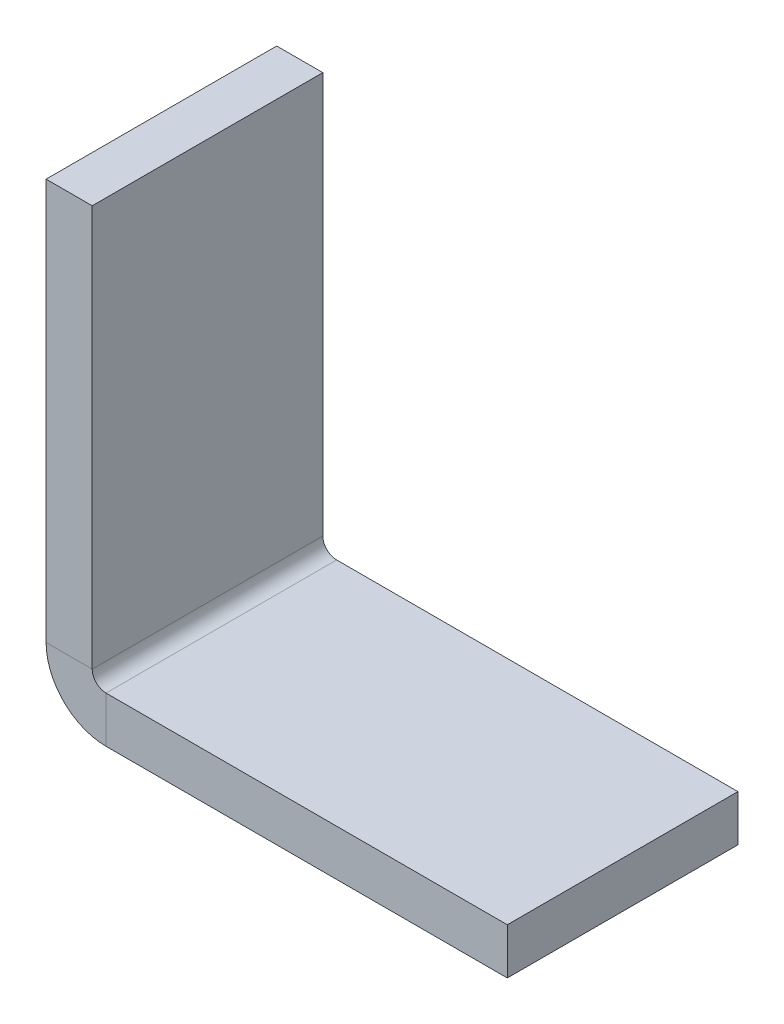
ISO-10303-21;
HEADER;
FILE_DESCRIPTION(('STEP AP214'),'2;1');
FILE_NAME('part.step','',(''),(''),'','','');
FILE_SCHEMA(('AUTOMOTIVE_DESIGN { 1 0 10303 214 1 1 1 1 }'));
ENDSEC;
DATA;
#1=APPLICATION_CONTEXT('core data for automotive mechanical design processes');
#2=APPLICATION_PROTOCOL_DEFINITION('international standard','automotive_design',2000,#1);
#3=PRODUCT_CONTEXT('',#1,'mechanical');
#4=PRODUCT('Part','Part','',(#3));
#5=PRODUCT_RELATED_PRODUCT_CATEGORY('part','',(#4));
#6=PRODUCT_DEFINITION_FORMATION('','',#4);
#7=PRODUCT_DEFINITION_CONTEXT('part definition',#1,'design');
#8=PRODUCT_DEFINITION('design','',#6,#7);
#9=PRODUCT_DEFINITION_SHAPE('','',#8);
#10=(LENGTH_UNIT() NAMED_UNIT(*) SI_UNIT(.MILLI.,.METRE.));
#11=(NAMED_UNIT(*) PLANE_ANGLE_UNIT() SI_UNIT($,.RADIAN.));
#12=(NAMED_UNIT(*) SI_UNIT($,.STERADIAN.) SOLID_ANGLE_UNIT());
#13=UNCERTAINTY_MEASURE_WITH_UNIT(LENGTH_MEASURE(1.E-05),#10,'distance_accuracy_value','');
#14=(GEOMETRIC_REPRESENTATION_CONTEXT(3) GLOBAL_UNCERTAINTY_ASSIGNED_CONTEXT((#13)) GLOBAL_UNIT_ASSIGNED_CONTEXT((#10,
#11,#12)) REPRESENTATION_CONTEXT('',''));
#15=CARTESIAN_POINT('',(0.,0.,0.));
#16=DIRECTION('',(0.,0.,1.));
#17=DIRECTION('',(1.,0.,0.));
#18=AXIS2_PLACEMENT_3D('',#15,#16,#17);
#19=CARTESIAN_POINT('',(53.5149587150397,25.4,0.));
#20=DIRECTION('',(0.,0.,1.));
#21=DIRECTION('',(0.,-1.,0.));
#22=AXIS2_PLACEMENT_3D('',#19,#20,#21);
#23=PLANE('',#22);
#24=DIRECTION('',(-1.,0.,0.));
#25=VECTOR('',#24,1.);
#26=CARTESIAN_POINT('',(53.5149587150397,3.302,0.));
#27=LINE('',#26,#25);
#28=CARTESIAN_POINT('',(2.54,3.302,0.));
#29=VERTEX_POINT('',#28);
#30=CARTESIAN_POINT('',(0.,3.302,0.));
#31=VERTEX_POINT('',#30);
#32=EDGE_CURVE('E50',#29,#31,#27,.T.);
#33=ORIENTED_EDGE('',*,*,#32,.T.);
#34=DIRECTION('',(0.,-1.,0.));
#35=VECTOR('',#34,1.);
#36=CARTESIAN_POINT('',(0.,25.4,0.));
#37=LINE('',#36,#35);
#38=CARTESIAN_POINT('',(0.,25.4,0.));
#39=VERTEX_POINT('',#38);
#40=EDGE_CURVE('E57',#39,#31,#37,.T.);
#41=ORIENTED_EDGE('',*,*,#40,.F.);
#42=DIRECTION('',(-1.,0.,0.));
#43=VECTOR('',#42,1.);
#44=CARTESIAN_POINT('',(53.5149587150397,25.4,0.));
#45=LINE('',#44,#43);
#46=CARTESIAN_POINT('',(2.54000000000001,25.4,0.));
#47=VERTEX_POINT('',#46);
#48=EDGE_CURVE('E185',#47,#39,#45,.T.);
#49=ORIENTED_EDGE('',*,*,#48,.F.);
#50=DIRECTION('',(0.,1.,0.));
#51=VECTOR('',#50,1.);
#52=CARTESIAN_POINT('',(2.54,25.4,0.));
#53=LINE('',#52,#51);
#54=EDGE_CURVE('E173',#29,#47,#53,.T.);
#55=ORIENTED_EDGE('',*,*,#54,.F.);
#56=EDGE_LOOP('',(#33,#41,#49,#55));
#57=FACE_BOUND('',#56,.T.);
#58=ADVANCED_FACE('F43',(#57),#23,.F.);
#59=CARTESIAN_POINT('',(53.5149587150397,25.4,12.7));
#60=DIRECTION('',(0.,1.,0.));
#61=DIRECTION('',(-1.,0.,0.));
#62=AXIS2_PLACEMENT_3D('',#59,#60,#61);
#63=PLANE('',#62);
#64=DIRECTION('',(0.,0.,-1.));
#65=VECTOR('',#64,1.);
#66=CARTESIAN_POINT('',(0.,25.4,12.7));
#67=LINE('',#66,#65);
#68=CARTESIAN_POINT('',(0.,25.4,12.7));
#69=VERTEX_POINT('',#68);
#70=EDGE_CURVE('E169',#69,#39,#67,.T.);
#71=ORIENTED_EDGE('',*,*,#70,.F.);
#72=DIRECTION('',(-1.,0.,0.));
#73=VECTOR('',#72,1.);
#74=CARTESIAN_POINT('',(53.5149587150397,25.4,12.7));
#75=LINE('',#74,#73);
#76=CARTESIAN_POINT('',(2.54000000000001,25.4,12.7));
#77=VERTEX_POINT('',#76);
#78=EDGE_CURVE('E183',#77,#69,#75,.T.);
#79=ORIENTED_EDGE('',*,*,#78,.F.);
#80=DIRECTION('',(0.,0.,-1.));
#81=VECTOR('',#80,1.);
#82=CARTESIAN_POINT('',(2.54,25.4,12.7));
#83=LINE('',#82,#81);
#84=EDGE_CURVE('E64',#77,#47,#83,.T.);
#85=ORIENTED_EDGE('',*,*,#84,.T.);
#86=ORIENTED_EDGE('',*,*,#48,.T.);
#87=EDGE_LOOP('',(#71,#79,#85,#86));
#88=FACE_BOUND('',#87,.T.);
#89=ADVANCED_FACE('F191',(#88),#63,.T.);
#90=CARTESIAN_POINT('',(53.5149587150397,25.4,12.7));
#91=DIRECTION('',(0.,0.,1.));
#92=DIRECTION('',(0.,-1.,0.));
#93=AXIS2_PLACEMENT_3D('',#90,#91,#92);
#94=PLANE('',#93);
#95=DIRECTION('',(0.,-1.,0.));
#96=VECTOR('',#95,1.);
#97=CARTESIAN_POINT('',(0.,25.4,12.7));
#98=LINE('',#97,#96);
#99=CARTESIAN_POINT('',(0.,3.302,12.7));
#100=VERTEX_POINT('',#99);
#101=EDGE_CURVE('E166',#69,#100,#98,.T.);
#102=ORIENTED_EDGE('',*,*,#101,.T.);
#103=DIRECTION('',(-1.,0.,0.));
#104=VECTOR('',#103,1.);
#105=CARTESIAN_POINT('',(53.5149587150397,3.302,12.7));
#106=LINE('',#105,#104);
#107=CARTESIAN_POINT('',(2.54,3.302,12.7));
#108=VERTEX_POINT('',#107);
#109=EDGE_CURVE('E180',#108,#100,#106,.T.);
#110=ORIENTED_EDGE('',*,*,#109,.F.);
#111=DIRECTION('',(0.,-1.,0.));
#112=VECTOR('',#111,1.);
#113=CARTESIAN_POINT('',(2.54,25.4,12.7));
#114=LINE('',#113,#112);
#115=EDGE_CURVE('E11',#77,#108,#114,.T.);
#116=ORIENTED_EDGE('',*,*,#115,.F.);
#117=ORIENTED_EDGE('',*,*,#78,.T.);
#118=EDGE_LOOP('',(#102,#110,#116,#117));
#119=FACE_BOUND('',#118,.T.);
#120=ADVANCED_FACE('F203',(#119),#94,.T.);
#121=CARTESIAN_POINT('',(2.54,25.4,12.7));
#122=DIRECTION('',(-1.,0.,0.));
#123=DIRECTION('',(0.,0.,1.));
#124=AXIS2_PLACEMENT_3D('',#121,#122,#123);
#125=PLANE('',#124);
#126=ORIENTED_EDGE('',*,*,#115,.T.);
#127=DIRECTION('',(0.,0.,-1.));
#128=VECTOR('',#127,1.);
#129=CARTESIAN_POINT('',(2.54,3.302,0.));
#130=LINE('',#129,#128);
#131=EDGE_CURVE('E177',#108,#29,#130,.T.);
#132=ORIENTED_EDGE('',*,*,#131,.T.);
#133=ORIENTED_EDGE('',*,*,#54,.T.);
#134=ORIENTED_EDGE('',*,*,#84,.F.);
#135=EDGE_LOOP('',(#126,#132,#133,#134));
#136=FACE_BOUND('',#135,.T.);
#137=ADVANCED_FACE('F193',(#136),#125,.F.);
#138=CARTESIAN_POINT('',(0.,25.4,12.7));
#139=DIRECTION('',(1.,0.,0.));
#140=DIRECTION('',(0.,0.,-1.));
#141=AXIS2_PLACEMENT_3D('',#138,#139,#140);
#142=PLANE('',#141);
#143=ORIENTED_EDGE('',*,*,#40,.T.);
#144=DIRECTION('',(0.,0.,1.));
#145=VECTOR('',#144,1.);
#146=CARTESIAN_POINT('',(0.,3.302,0.));
#147=LINE('',#146,#145);
#148=EDGE_CURVE('E128',#31,#100,#147,.T.);
#149=ORIENTED_EDGE('',*,*,#148,.T.);
#150=ORIENTED_EDGE('',*,*,#101,.F.);
#151=ORIENTED_EDGE('',*,*,#70,.T.);
#152=EDGE_LOOP('',(#143,#149,#150,#151));
#153=FACE_BOUND('',#152,.T.);
#154=ADVANCED_FACE('F188',(#153),#142,.F.);
#155=CARTESIAN_POINT('',(25.4,53.5149587150397,12.7));
#156=DIRECTION('',(-1.,0.,0.));
#157=DIRECTION('',(0.,0.,1.));
#158=AXIS2_PLACEMENT_3D('',#155,#156,#157);
#159=PLANE('',#158);
#160=DIRECTION('',(0.,-1.,0.));
#161=VECTOR('',#160,1.);
#162=CARTESIAN_POINT('',(25.4,53.5149587150397,12.7));
#163=LINE('',#162,#161);
#164=CARTESIAN_POINT('',(25.4,2.54000000000001,12.7));
#165=VERTEX_POINT('',#164);
#166=CARTESIAN_POINT('',(25.4,0.,12.7));
#167=VERTEX_POINT('',#166);
#168=EDGE_CURVE('E140',#165,#167,#163,.T.);
#169=ORIENTED_EDGE('',*,*,#168,.T.);
#170=DIRECTION('',(0.,0.,-1.));
#171=VECTOR('',#170,1.);
#172=CARTESIAN_POINT('',(25.4,0.,12.7));
#173=LINE('',#172,#171);
#174=CARTESIAN_POINT('',(25.4,0.,0.));
#175=VERTEX_POINT('',#174);
#176=EDGE_CURVE('E160',#167,#175,#173,.T.);
#177=ORIENTED_EDGE('',*,*,#176,.T.);
#178=DIRECTION('',(0.,-1.,0.));
#179=VECTOR('',#178,1.);
#180=CARTESIAN_POINT('',(25.4,53.5149587150397,0.));
#181=LINE('',#180,#179);
#182=CARTESIAN_POINT('',(25.4,2.54,0.));
#183=VERTEX_POINT('',#182);
#184=EDGE_CURVE('E145',#183,#175,#181,.T.);
#185=ORIENTED_EDGE('',*,*,#184,.F.);
#186=DIRECTION('',(0.,0.,-1.));
#187=VECTOR('',#186,1.);
#188=CARTESIAN_POINT('',(25.4,2.54,12.7));
#189=LINE('',#188,#187);
#190=EDGE_CURVE('E158',#165,#183,#189,.T.);
#191=ORIENTED_EDGE('',*,*,#190,.F.);
#192=EDGE_LOOP('',(#169,#177,#185,#191));
#193=FACE_BOUND('',#192,.T.);
#194=ADVANCED_FACE('F230',(#193),#159,.F.);
#195=CARTESIAN_POINT('',(2.54,2.54,12.7));
#196=DIRECTION('',(0.,-1.,0.));
#197=DIRECTION('',(0.,0.,-1.));
#198=AXIS2_PLACEMENT_3D('',#195,#196,#197);
#199=PLANE('',#198);
#200=DIRECTION('',(0.,0.,-1.));
#201=VECTOR('',#200,1.);
#202=CARTESIAN_POINT('',(3.302,2.54,0.));
#203=LINE('',#202,#201);
#204=CARTESIAN_POINT('',(3.302,2.54,12.7));
#205=VERTEX_POINT('',#204);
#206=CARTESIAN_POINT('',(3.302,2.54,0.));
#207=VERTEX_POINT('',#206);
#208=EDGE_CURVE('E121',#205,#207,#203,.T.);
#209=ORIENTED_EDGE('',*,*,#208,.F.);
#210=DIRECTION('',(-1.,0.,0.));
#211=VECTOR('',#210,1.);
#212=CARTESIAN_POINT('',(2.54,2.54,12.7));
#213=LINE('',#212,#211);
#214=EDGE_CURVE('E149',#165,#205,#213,.T.);
#215=ORIENTED_EDGE('',*,*,#214,.F.);
#216=ORIENTED_EDGE('',*,*,#190,.T.);
#217=DIRECTION('',(-1.,0.,0.));
#218=VECTOR('',#217,1.);
#219=CARTESIAN_POINT('',(2.54,2.54,0.));
#220=LINE('',#219,#218);
#221=EDGE_CURVE('E156',#183,#207,#220,.T.);
#222=ORIENTED_EDGE('',*,*,#221,.T.);
#223=EDGE_LOOP('',(#209,#215,#216,#222));
#224=FACE_BOUND('',#223,.T.);
#225=ADVANCED_FACE('F235',(#224),#199,.F.);
#226=CARTESIAN_POINT('',(2.54,53.5149587150397,12.7));
#227=DIRECTION('',(0.,0.,1.));
#228=DIRECTION('',(1.,0.,0.));
#229=AXIS2_PLACEMENT_3D('',#226,#227,#228);
#230=PLANE('',#229);
#231=DIRECTION('',(1.,0.,0.));
#232=VECTOR('',#231,1.);
#233=CARTESIAN_POINT('',(0.,0.,12.7));
#234=LINE('',#233,#232);
#235=CARTESIAN_POINT('',(3.302,0.,12.7));
#236=VERTEX_POINT('',#235);
#237=EDGE_CURVE('E138',#236,#167,#234,.T.);
#238=ORIENTED_EDGE('',*,*,#237,.T.);
#239=ORIENTED_EDGE('',*,*,#168,.F.);
#240=ORIENTED_EDGE('',*,*,#214,.T.);
#241=DIRECTION('',(0.,-1.,0.));
#242=VECTOR('',#241,1.);
#243=CARTESIAN_POINT('',(3.302,53.5149587150397,12.7));
#244=LINE('',#243,#242);
#245=EDGE_CURVE('E146',#205,#236,#244,.T.);
#246=ORIENTED_EDGE('',*,*,#245,.T.);
#247=EDGE_LOOP('',(#238,#239,#240,#246));
#248=FACE_BOUND('',#247,.T.);
#249=ADVANCED_FACE('F245',(#248),#230,.T.);
#250=CARTESIAN_POINT('',(0.,0.,12.7));
#251=DIRECTION('',(0.,1.,0.));
#252=DIRECTION('',(0.,0.,1.));
#253=AXIS2_PLACEMENT_3D('',#250,#251,#252);
#254=PLANE('',#253);
#255=DIRECTION('',(0.,0.,1.));
#256=VECTOR('',#255,1.);
#257=CARTESIAN_POINT('',(3.302,0.,0.));
#258=LINE('',#257,#256);
#259=CARTESIAN_POINT('',(3.302,0.,0.));
#260=VERTEX_POINT('',#259);
#261=EDGE_CURVE('E120',#260,#236,#258,.T.);
#262=ORIENTED_EDGE('',*,*,#261,.F.);
#263=DIRECTION('',(1.,0.,0.));
#264=VECTOR('',#263,1.);
#265=CARTESIAN_POINT('',(0.,0.,0.));
#266=LINE('',#265,#264);
#267=EDGE_CURVE('E135',#260,#175,#266,.T.);
#268=ORIENTED_EDGE('',*,*,#267,.T.);
#269=ORIENTED_EDGE('',*,*,#176,.F.);
#270=ORIENTED_EDGE('',*,*,#237,.F.);
#271=EDGE_LOOP('',(#262,#268,#269,#270));
#272=FACE_BOUND('',#271,.T.);
#273=ADVANCED_FACE('F134',(#272),#254,.F.);
#274=CARTESIAN_POINT('',(2.54,53.5149587150397,0.));
#275=DIRECTION('',(0.,0.,1.));
#276=DIRECTION('',(1.,0.,0.));
#277=AXIS2_PLACEMENT_3D('',#274,#275,#276);
#278=PLANE('',#277);
#279=ORIENTED_EDGE('',*,*,#184,.T.);
#280=ORIENTED_EDGE('',*,*,#267,.F.);
#281=DIRECTION('',(0.,-1.,0.));
#282=VECTOR('',#281,1.);
#283=CARTESIAN_POINT('',(3.302,53.5149587150397,0.));
#284=LINE('',#283,#282);
#285=EDGE_CURVE('E109',#207,#260,#284,.T.);
#286=ORIENTED_EDGE('',*,*,#285,.F.);
#287=ORIENTED_EDGE('',*,*,#221,.F.);
#288=EDGE_LOOP('',(#279,#280,#286,#287));
#289=FACE_BOUND('',#288,.T.);
#290=ADVANCED_FACE('F143',(#289),#278,.F.);
#291=CARTESIAN_POINT('',(3.302,3.302,0.));
#292=DIRECTION('',(0.,0.,-1.));
#293=DIRECTION('',(-1.,0.,0.));
#294=AXIS2_PLACEMENT_3D('',#291,#292,#293);
#295=PLANE('',#294);
#296=ORIENTED_EDGE('',*,*,#32,.F.);
#297=CARTESIAN_POINT('',(3.302,3.302,0.));
#298=DIRECTION('',(0.,0.,1.));
#299=DIRECTION('',(1.,0.,0.));
#300=AXIS2_PLACEMENT_3D('',#297,#298,#299);
#301=CIRCLE('',#300,0.762);
#302=EDGE_CURVE('E114',#29,#207,#301,.T.);
#303=ORIENTED_EDGE('',*,*,#302,.T.);
#304=ORIENTED_EDGE('',*,*,#285,.T.);
#305=CARTESIAN_POINT('',(3.302,3.302,0.));
#306=DIRECTION('',(0.,0.,1.));
#307=DIRECTION('',(1.,0.,0.));
#308=AXIS2_PLACEMENT_3D('',#305,#306,#307);
#309=CIRCLE('',#308,3.302);
#310=EDGE_CURVE('E112',#31,#260,#309,.T.);
#311=ORIENTED_EDGE('',*,*,#310,.F.);
#312=EDGE_LOOP('',(#296,#303,#304,#311));
#313=FACE_BOUND('',#312,.T.);
#314=ADVANCED_FACE('F111',(#313),#295,.T.);
#315=CARTESIAN_POINT('',(3.302,3.302,12.7));
#316=DIRECTION('',(0.,0.,1.));
#317=DIRECTION('',(1.,0.,0.));
#318=AXIS2_PLACEMENT_3D('',#315,#316,#317);
#319=PLANE('',#318);
#320=CARTESIAN_POINT('',(3.302,3.302,12.7));
#321=DIRECTION('',(0.,0.,1.));
#322=DIRECTION('',(1.,0.,0.));
#323=AXIS2_PLACEMENT_3D('',#320,#321,#322);
#324=CIRCLE('',#323,0.762);
#325=EDGE_CURVE('E130',#205,#108,#324,.F.);
#326=ORIENTED_EDGE('',*,*,#325,.T.);
#327=ORIENTED_EDGE('',*,*,#109,.T.);
#328=CARTESIAN_POINT('',(3.302,3.302,12.7));
#329=DIRECTION('',(0.,0.,1.));
#330=DIRECTION('',(1.,0.,0.));
#331=AXIS2_PLACEMENT_3D('',#328,#329,#330);
#332=CIRCLE('',#331,3.302);
#333=EDGE_CURVE('E129',#236,#100,#332,.F.);
#334=ORIENTED_EDGE('',*,*,#333,.F.);
#335=ORIENTED_EDGE('',*,*,#245,.F.);
#336=EDGE_LOOP('',(#326,#327,#334,#335));
#337=FACE_BOUND('',#336,.T.);
#338=ADVANCED_FACE('F201',(#337),#319,.T.);
#339=CARTESIAN_POINT('',(3.302,3.302,-49.1258658826706));
#340=DIRECTION('',(0.,0.,1.));
#341=DIRECTION('',(1.,0.,0.));
#342=AXIS2_PLACEMENT_3D('',#339,#340,#341);
#343=CYLINDRICAL_SURFACE('',#342,3.302);
#344=ORIENTED_EDGE('',*,*,#261,.T.);
#345=ORIENTED_EDGE('',*,*,#333,.T.);
#346=ORIENTED_EDGE('',*,*,#148,.F.);
#347=ORIENTED_EDGE('',*,*,#310,.T.);
#348=EDGE_LOOP('',(#344,#345,#346,#347));
#349=FACE_BOUND('',#348,.T.);
#350=ADVANCED_FACE('F125',(#349),#343,.T.);
#351=CARTESIAN_POINT('',(3.302,3.302,-49.1258658826706));
#352=DIRECTION('',(0.,0.,1.));
#353=DIRECTION('',(1.,0.,0.));
#354=AXIS2_PLACEMENT_3D('',#351,#352,#353);
#355=CYLINDRICAL_SURFACE('',#354,0.762);
#356=ORIENTED_EDGE('',*,*,#208,.T.);
#357=ORIENTED_EDGE('',*,*,#302,.F.);
#358=ORIENTED_EDGE('',*,*,#131,.F.);
#359=ORIENTED_EDGE('',*,*,#325,.F.);
#360=EDGE_LOOP('',(#356,#357,#358,#359));
#361=FACE_BOUND('',#360,.T.);
#362=ADVANCED_FACE('F197',(#361),#355,.F.);
#363=CLOSED_SHELL('',(#58,#89,#120,#137,#154,#194,#225,#249,#273,#290,#314,#338,#350,#362));
#364=MANIFOLD_SOLID_BREP('B2',#363);
#365=ADVANCED_BREP_SHAPE_REPRESENTATION('',(#18,#364),#14);
#366=SHAPE_DEFINITION_REPRESENTATION(#9,#365);
ENDSEC;
END-ISO-10303-21;
